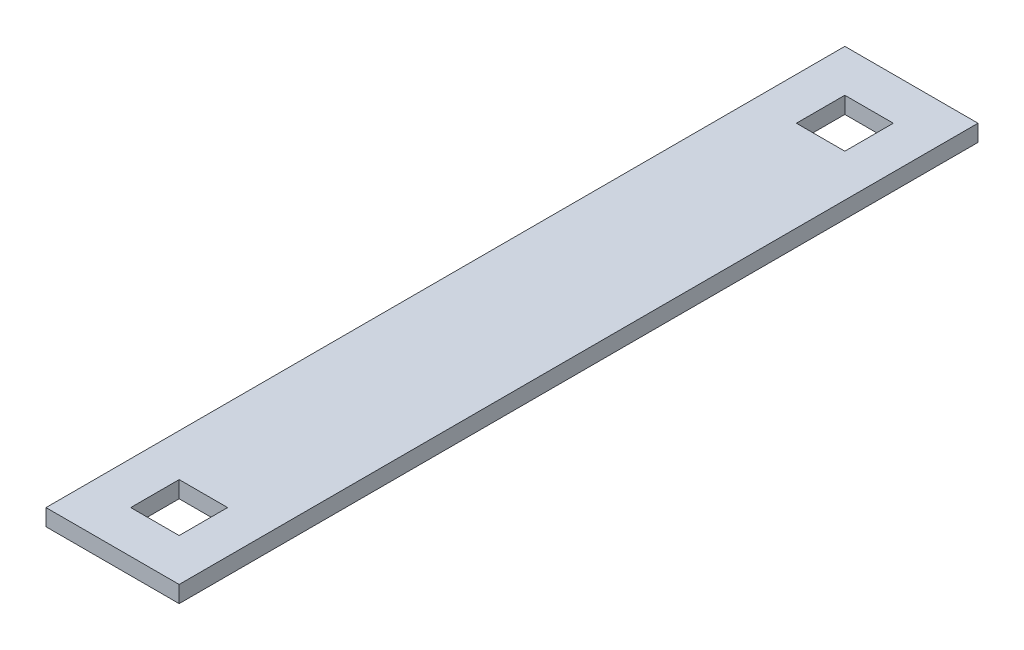
ISO-10303-21;
HEADER;
FILE_DESCRIPTION(('STEP AP214'),'2;1');
FILE_NAME('part.step','',(''),(''),'','','');
FILE_SCHEMA(('AUTOMOTIVE_DESIGN { 1 0 10303 214 1 1 1 1 }'));
ENDSEC;
DATA;
#1=APPLICATION_CONTEXT('core data for automotive mechanical design processes');
#2=APPLICATION_PROTOCOL_DEFINITION('international standard','automotive_design',2000,#1);
#3=PRODUCT_CONTEXT('',#1,'mechanical');
#4=PRODUCT('Part','Part','',(#3));
#5=PRODUCT_RELATED_PRODUCT_CATEGORY('part','',(#4));
#6=PRODUCT_DEFINITION_FORMATION('','',#4);
#7=PRODUCT_DEFINITION_CONTEXT('part definition',#1,'design');
#8=PRODUCT_DEFINITION('design','',#6,#7);
#9=PRODUCT_DEFINITION_SHAPE('','',#8);
#10=(LENGTH_UNIT() NAMED_UNIT(*) SI_UNIT(.MILLI.,.METRE.));
#11=(NAMED_UNIT(*) PLANE_ANGLE_UNIT() SI_UNIT($,.RADIAN.));
#12=(NAMED_UNIT(*) SI_UNIT($,.STERADIAN.) SOLID_ANGLE_UNIT());
#13=UNCERTAINTY_MEASURE_WITH_UNIT(LENGTH_MEASURE(1.E-05),#10,'distance_accuracy_value','');
#14=(GEOMETRIC_REPRESENTATION_CONTEXT(3) GLOBAL_UNCERTAINTY_ASSIGNED_CONTEXT((#13)) GLOBAL_UNIT_ASSIGNED_CONTEXT((#10,
#11,#12)) REPRESENTATION_CONTEXT('',''));
#15=CARTESIAN_POINT('',(0.,0.,0.));
#16=DIRECTION('',(0.,0.,1.));
#17=DIRECTION('',(1.,0.,0.));
#18=AXIS2_PLACEMENT_3D('',#15,#16,#17);
#19=CARTESIAN_POINT('',(0.,1.5875,0.));
#20=DIRECTION('',(0.,1.,0.));
#21=DIRECTION('',(0.,0.,1.));
#22=AXIS2_PLACEMENT_3D('',#19,#20,#21);
#23=PLANE('',#22);
#24=DIRECTION('',(0.,0.,1.));
#25=VECTOR('',#24,1.);
#26=CARTESIAN_POINT('',(0.,1.5875,-101.537542425712));
#27=LINE('',#26,#25);
#28=CARTESIAN_POINT('',(0.,1.5875,-101.537542425712));
#29=VERTEX_POINT('',#28);
#30=CARTESIAN_POINT('',(0.,1.5875,-25.3375424257115));
#31=VERTEX_POINT('',#30);
#32=EDGE_CURVE('E189',#29,#31,#27,.T.);
#33=ORIENTED_EDGE('',*,*,#32,.T.);
#34=DIRECTION('',(1.,0.,0.));
#35=VECTOR('',#34,1.);
#36=CARTESIAN_POINT('',(0.,1.5875,-25.3375424257115));
#37=LINE('',#36,#35);
#38=CARTESIAN_POINT('',(12.7,1.5875,-25.3375424257115));
#39=VERTEX_POINT('',#38);
#40=EDGE_CURVE('E192',#31,#39,#37,.T.);
#41=ORIENTED_EDGE('',*,*,#40,.T.);
#42=DIRECTION('',(0.,0.,-1.));
#43=VECTOR('',#42,1.);
#44=CARTESIAN_POINT('',(12.7,1.5875,-101.537542425712));
#45=LINE('',#44,#43);
#46=CARTESIAN_POINT('',(12.7,1.5875,-101.537542425712));
#47=VERTEX_POINT('',#46);
#48=EDGE_CURVE('E195',#39,#47,#45,.T.);
#49=ORIENTED_EDGE('',*,*,#48,.T.);
#50=DIRECTION('',(-1.,0.,0.));
#51=VECTOR('',#50,1.);
#52=CARTESIAN_POINT('',(0.,1.5875,-101.537542425712));
#53=LINE('',#52,#51);
#54=EDGE_CURVE('E197',#47,#29,#53,.T.);
#55=ORIENTED_EDGE('',*,*,#54,.T.);
#56=EDGE_LOOP('',(#33,#41,#49,#55));
#57=FACE_BOUND('',#56,.T.);
#58=DIRECTION('',(1.,0.,0.));
#59=VECTOR('',#58,1.);
#60=CARTESIAN_POINT('',(4.0372,1.5875,-92.8747424257115));
#61=LINE('',#60,#59);
#62=CARTESIAN_POINT('',(4.0372,1.5875,-92.8747424257115));
#63=VERTEX_POINT('',#62);
#64=CARTESIAN_POINT('',(8.66,1.5875,-92.8747424257115));
#65=VERTEX_POINT('',#64);
#66=EDGE_CURVE('E160',#63,#65,#61,.T.);
#67=ORIENTED_EDGE('',*,*,#66,.F.);
#68=DIRECTION('',(0.,0.,1.));
#69=VECTOR('',#68,1.);
#70=CARTESIAN_POINT('',(4.0372,1.5875,-97.4975424257115));
#71=LINE('',#70,#69);
#72=CARTESIAN_POINT('',(4.0372,1.5875,-97.4975424257115));
#73=VERTEX_POINT('',#72);
#74=EDGE_CURVE('E158',#73,#63,#71,.T.);
#75=ORIENTED_EDGE('',*,*,#74,.F.);
#76=DIRECTION('',(-1.,0.,0.));
#77=VECTOR('',#76,1.);
#78=CARTESIAN_POINT('',(4.0372,1.5875,-97.4975424257115));
#79=LINE('',#78,#77);
#80=CARTESIAN_POINT('',(8.66,1.5875,-97.4975424257115));
#81=VERTEX_POINT('',#80);
#82=EDGE_CURVE('E166',#81,#73,#79,.T.);
#83=ORIENTED_EDGE('',*,*,#82,.F.);
#84=DIRECTION('',(0.,0.,-1.));
#85=VECTOR('',#84,1.);
#86=CARTESIAN_POINT('',(8.66,1.5875,-97.4975424257115));
#87=LINE('',#86,#85);
#88=EDGE_CURVE('E163',#65,#81,#87,.T.);
#89=ORIENTED_EDGE('',*,*,#88,.F.);
#90=EDGE_LOOP('',(#67,#75,#83,#89));
#91=FACE_BOUND('',#90,.T.);
#92=DIRECTION('',(1.,0.,0.));
#93=VECTOR('',#92,1.);
#94=CARTESIAN_POINT('',(4.04000000000001,1.5875,-29.3775424257115));
#95=LINE('',#94,#93);
#96=CARTESIAN_POINT('',(4.04000000000001,1.5875,-29.3775424257115));
#97=VERTEX_POINT('',#96);
#98=CARTESIAN_POINT('',(8.66000000000001,1.5875,-29.3775424257115));
#99=VERTEX_POINT('',#98);
#100=EDGE_CURVE('E130',#97,#99,#95,.T.);
#101=ORIENTED_EDGE('',*,*,#100,.F.);
#102=DIRECTION('',(0.,0.,1.));
#103=VECTOR('',#102,1.);
#104=CARTESIAN_POINT('',(4.04000000000001,1.5875,-34.0003424257115));
#105=LINE('',#104,#103);
#106=CARTESIAN_POINT('',(4.04000000000001,1.5875,-34.0003424257115));
#107=VERTEX_POINT('',#106);
#108=EDGE_CURVE('E122',#107,#97,#105,.T.);
#109=ORIENTED_EDGE('',*,*,#108,.F.);
#110=DIRECTION('',(-1.,0.,0.));
#111=VECTOR('',#110,1.);
#112=CARTESIAN_POINT('',(4.04000000000001,1.5875,-34.0003424257115));
#113=LINE('',#112,#111);
#114=CARTESIAN_POINT('',(8.66000000000001,1.5875,-34.0003424257115));
#115=VERTEX_POINT('',#114);
#116=EDGE_CURVE('E144',#115,#107,#113,.T.);
#117=ORIENTED_EDGE('',*,*,#116,.F.);
#118=DIRECTION('',(0.,0.,-1.));
#119=VECTOR('',#118,1.);
#120=CARTESIAN_POINT('',(8.66000000000001,1.5875,-34.0003424257115));
#121=LINE('',#120,#119);
#122=EDGE_CURVE('E142',#99,#115,#121,.T.);
#123=ORIENTED_EDGE('',*,*,#122,.F.);
#124=EDGE_LOOP('',(#101,#109,#117,#123));
#125=FACE_BOUND('',#124,.T.);
#126=ADVANCED_FACE('F33',(#57,#91,#125),#23,.T.);
#127=CARTESIAN_POINT('',(0.,0.,0.));
#128=DIRECTION('',(0.,1.,0.));
#129=DIRECTION('',(0.,0.,1.));
#130=AXIS2_PLACEMENT_3D('',#127,#128,#129);
#131=PLANE('',#130);
#132=DIRECTION('',(0.,0.,1.));
#133=VECTOR('',#132,1.);
#134=CARTESIAN_POINT('',(4.0372,0.,-97.4975424257115));
#135=LINE('',#134,#133);
#136=CARTESIAN_POINT('',(4.0372,0.,-97.4975424257115));
#137=VERTEX_POINT('',#136);
#138=CARTESIAN_POINT('',(4.0372,0.,-92.8747424257115));
#139=VERTEX_POINT('',#138);
#140=EDGE_CURVE('E138',#137,#139,#135,.T.);
#141=ORIENTED_EDGE('',*,*,#140,.T.);
#142=DIRECTION('',(1.,0.,0.));
#143=VECTOR('',#142,1.);
#144=CARTESIAN_POINT('',(4.0372,0.,-92.8747424257115));
#145=LINE('',#144,#143);
#146=CARTESIAN_POINT('',(8.66,0.,-92.8747424257115));
#147=VERTEX_POINT('',#146);
#148=EDGE_CURVE('E171',#139,#147,#145,.T.);
#149=ORIENTED_EDGE('',*,*,#148,.T.);
#150=DIRECTION('',(0.,0.,-1.));
#151=VECTOR('',#150,1.);
#152=CARTESIAN_POINT('',(8.66,0.,-97.4975424257115));
#153=LINE('',#152,#151);
#154=CARTESIAN_POINT('',(8.66,0.,-97.4975424257115));
#155=VERTEX_POINT('',#154);
#156=EDGE_CURVE('E174',#147,#155,#153,.T.);
#157=ORIENTED_EDGE('',*,*,#156,.T.);
#158=DIRECTION('',(-1.,0.,0.));
#159=VECTOR('',#158,1.);
#160=CARTESIAN_POINT('',(4.0372,0.,-97.4975424257115));
#161=LINE('',#160,#159);
#162=EDGE_CURVE('E161',#155,#137,#161,.T.);
#163=ORIENTED_EDGE('',*,*,#162,.T.);
#164=EDGE_LOOP('',(#141,#149,#157,#163));
#165=FACE_BOUND('',#164,.T.);
#166=DIRECTION('',(0.,0.,1.));
#167=VECTOR('',#166,1.);
#168=CARTESIAN_POINT('',(0.,0.,-101.537542425712));
#169=LINE('',#168,#167);
#170=CARTESIAN_POINT('',(0.,0.,-101.537542425712));
#171=VERTEX_POINT('',#170);
#172=CARTESIAN_POINT('',(0.,0.,-25.3375424257115));
#173=VERTEX_POINT('',#172);
#174=EDGE_CURVE('E188',#171,#173,#169,.T.);
#175=ORIENTED_EDGE('',*,*,#174,.F.);
#176=DIRECTION('',(-1.,0.,0.));
#177=VECTOR('',#176,1.);
#178=CARTESIAN_POINT('',(0.,0.,-101.537542425712));
#179=LINE('',#178,#177);
#180=CARTESIAN_POINT('',(12.7,0.,-101.537542425712));
#181=VERTEX_POINT('',#180);
#182=EDGE_CURVE('E193',#181,#171,#179,.T.);
#183=ORIENTED_EDGE('',*,*,#182,.F.);
#184=DIRECTION('',(0.,0.,-1.));
#185=VECTOR('',#184,1.);
#186=CARTESIAN_POINT('',(12.7,0.,-101.537542425712));
#187=LINE('',#186,#185);
#188=CARTESIAN_POINT('',(12.7,0.,-25.3375424257115));
#189=VERTEX_POINT('',#188);
#190=EDGE_CURVE('E204',#189,#181,#187,.T.);
#191=ORIENTED_EDGE('',*,*,#190,.F.);
#192=DIRECTION('',(1.,0.,0.));
#193=VECTOR('',#192,1.);
#194=CARTESIAN_POINT('',(0.,0.,-25.3375424257115));
#195=LINE('',#194,#193);
#196=EDGE_CURVE('E202',#173,#189,#195,.T.);
#197=ORIENTED_EDGE('',*,*,#196,.F.);
#198=EDGE_LOOP('',(#175,#183,#191,#197));
#199=FACE_BOUND('',#198,.T.);
#200=DIRECTION('',(0.,0.,1.));
#201=VECTOR('',#200,1.);
#202=CARTESIAN_POINT('',(4.04000000000001,0.,-34.0003424257115));
#203=LINE('',#202,#201);
#204=CARTESIAN_POINT('',(4.04000000000001,0.,-34.0003424257115));
#205=VERTEX_POINT('',#204);
#206=CARTESIAN_POINT('',(4.04000000000001,0.,-29.3775424257115));
#207=VERTEX_POINT('',#206);
#208=EDGE_CURVE('E56',#205,#207,#203,.T.);
#209=ORIENTED_EDGE('',*,*,#208,.T.);
#210=DIRECTION('',(1.,0.,0.));
#211=VECTOR('',#210,1.);
#212=CARTESIAN_POINT('',(4.04000000000001,0.,-29.3775424257115));
#213=LINE('',#212,#211);
#214=CARTESIAN_POINT('',(8.66000000000001,0.,-29.3775424257115));
#215=VERTEX_POINT('',#214);
#216=EDGE_CURVE('E137',#207,#215,#213,.T.);
#217=ORIENTED_EDGE('',*,*,#216,.T.);
#218=DIRECTION('',(0.,0.,-1.));
#219=VECTOR('',#218,1.);
#220=CARTESIAN_POINT('',(8.66000000000001,0.,-34.0003424257115));
#221=LINE('',#220,#219);
#222=CARTESIAN_POINT('',(8.66000000000001,0.,-34.0003424257115));
#223=VERTEX_POINT('',#222);
#224=EDGE_CURVE('E150',#215,#223,#221,.T.);
#225=ORIENTED_EDGE('',*,*,#224,.T.);
#226=DIRECTION('',(-1.,0.,0.));
#227=VECTOR('',#226,1.);
#228=CARTESIAN_POINT('',(4.04000000000001,0.,-34.0003424257115));
#229=LINE('',#228,#227);
#230=EDGE_CURVE('E131',#223,#205,#229,.T.);
#231=ORIENTED_EDGE('',*,*,#230,.T.);
#232=EDGE_LOOP('',(#209,#217,#225,#231));
#233=FACE_BOUND('',#232,.T.);
#234=ADVANCED_FACE('F222',(#165,#199,#233),#131,.F.);
#235=CARTESIAN_POINT('',(0.,1.5875,-101.537542425712));
#236=DIRECTION('',(1.,0.,0.));
#237=DIRECTION('',(0.,0.,-1.));
#238=AXIS2_PLACEMENT_3D('',#235,#236,#237);
#239=PLANE('',#238);
#240=ORIENTED_EDGE('',*,*,#174,.T.);
#241=DIRECTION('',(0.,-1.,0.));
#242=VECTOR('',#241,1.);
#243=CARTESIAN_POINT('',(0.,1.5875,-25.3375424257115));
#244=LINE('',#243,#242);
#245=EDGE_CURVE('E11',#31,#173,#244,.T.);
#246=ORIENTED_EDGE('',*,*,#245,.F.);
#247=ORIENTED_EDGE('',*,*,#32,.F.);
#248=DIRECTION('',(0.,-1.,0.));
#249=VECTOR('',#248,1.);
#250=CARTESIAN_POINT('',(0.,1.5875,-101.537542425712));
#251=LINE('',#250,#249);
#252=EDGE_CURVE('E199',#29,#171,#251,.T.);
#253=ORIENTED_EDGE('',*,*,#252,.T.);
#254=EDGE_LOOP('',(#240,#246,#247,#253));
#255=FACE_BOUND('',#254,.T.);
#256=ADVANCED_FACE('F35',(#255),#239,.F.);
#257=CARTESIAN_POINT('',(0.,1.5875,-25.3375424257115));
#258=DIRECTION('',(0.,0.,-1.));
#259=DIRECTION('',(-1.,0.,0.));
#260=AXIS2_PLACEMENT_3D('',#257,#258,#259);
#261=PLANE('',#260);
#262=ORIENTED_EDGE('',*,*,#196,.T.);
#263=DIRECTION('',(0.,-1.,0.));
#264=VECTOR('',#263,1.);
#265=CARTESIAN_POINT('',(12.7,1.5875,-25.3375424257115));
#266=LINE('',#265,#264);
#267=EDGE_CURVE('E41',#39,#189,#266,.T.);
#268=ORIENTED_EDGE('',*,*,#267,.F.);
#269=ORIENTED_EDGE('',*,*,#40,.F.);
#270=ORIENTED_EDGE('',*,*,#245,.T.);
#271=EDGE_LOOP('',(#262,#268,#269,#270));
#272=FACE_BOUND('',#271,.T.);
#273=ADVANCED_FACE('F233',(#272),#261,.F.);
#274=CARTESIAN_POINT('',(12.7,1.5875,-101.537542425712));
#275=DIRECTION('',(-1.,0.,0.));
#276=DIRECTION('',(0.,0.,1.));
#277=AXIS2_PLACEMENT_3D('',#274,#275,#276);
#278=PLANE('',#277);
#279=ORIENTED_EDGE('',*,*,#190,.T.);
#280=DIRECTION('',(0.,-1.,0.));
#281=VECTOR('',#280,1.);
#282=CARTESIAN_POINT('',(12.7,1.5875,-101.537542425712));
#283=LINE('',#282,#281);
#284=EDGE_CURVE('E209',#47,#181,#283,.T.);
#285=ORIENTED_EDGE('',*,*,#284,.F.);
#286=ORIENTED_EDGE('',*,*,#48,.F.);
#287=ORIENTED_EDGE('',*,*,#267,.T.);
#288=EDGE_LOOP('',(#279,#285,#286,#287));
#289=FACE_BOUND('',#288,.T.);
#290=ADVANCED_FACE('F216',(#289),#278,.F.);
#291=CARTESIAN_POINT('',(0.,1.5875,-101.537542425712));
#292=DIRECTION('',(0.,0.,1.));
#293=DIRECTION('',(1.,0.,0.));
#294=AXIS2_PLACEMENT_3D('',#291,#292,#293);
#295=PLANE('',#294);
#296=ORIENTED_EDGE('',*,*,#182,.T.);
#297=ORIENTED_EDGE('',*,*,#252,.F.);
#298=ORIENTED_EDGE('',*,*,#54,.F.);
#299=ORIENTED_EDGE('',*,*,#284,.T.);
#300=EDGE_LOOP('',(#296,#297,#298,#299));
#301=FACE_BOUND('',#300,.T.);
#302=ADVANCED_FACE('F226',(#301),#295,.F.);
#303=CARTESIAN_POINT('',(4.0372,1.5875,-97.4975424257115));
#304=DIRECTION('',(1.,0.,0.));
#305=DIRECTION('',(0.,0.,-1.));
#306=AXIS2_PLACEMENT_3D('',#303,#304,#305);
#307=PLANE('',#306);
#308=ORIENTED_EDGE('',*,*,#140,.F.);
#309=DIRECTION('',(0.,-1.,0.));
#310=VECTOR('',#309,1.);
#311=CARTESIAN_POINT('',(4.0372,1.5875,-97.4975424257115));
#312=LINE('',#311,#310);
#313=EDGE_CURVE('E168',#73,#137,#312,.T.);
#314=ORIENTED_EDGE('',*,*,#313,.F.);
#315=ORIENTED_EDGE('',*,*,#74,.T.);
#316=DIRECTION('',(0.,-1.,0.));
#317=VECTOR('',#316,1.);
#318=CARTESIAN_POINT('',(4.0372,1.5875,-92.8747424257115));
#319=LINE('',#318,#317);
#320=EDGE_CURVE('E185',#63,#139,#319,.T.);
#321=ORIENTED_EDGE('',*,*,#320,.T.);
#322=EDGE_LOOP('',(#308,#314,#315,#321));
#323=FACE_BOUND('',#322,.T.);
#324=ADVANCED_FACE('F248',(#323),#307,.T.);
#325=CARTESIAN_POINT('',(4.0372,1.5875,-92.8747424257115));
#326=DIRECTION('',(0.,0.,-1.));
#327=DIRECTION('',(-1.,0.,0.));
#328=AXIS2_PLACEMENT_3D('',#325,#326,#327);
#329=PLANE('',#328);
#330=ORIENTED_EDGE('',*,*,#148,.F.);
#331=ORIENTED_EDGE('',*,*,#320,.F.);
#332=ORIENTED_EDGE('',*,*,#66,.T.);
#333=DIRECTION('',(0.,-1.,0.));
#334=VECTOR('',#333,1.);
#335=CARTESIAN_POINT('',(8.66,1.5875,-92.8747424257115));
#336=LINE('',#335,#334);
#337=EDGE_CURVE('E183',#65,#147,#336,.T.);
#338=ORIENTED_EDGE('',*,*,#337,.T.);
#339=EDGE_LOOP('',(#330,#331,#332,#338));
#340=FACE_BOUND('',#339,.T.);
#341=ADVANCED_FACE('F255',(#340),#329,.T.);
#342=CARTESIAN_POINT('',(8.66,1.5875,-97.4975424257115));
#343=DIRECTION('',(-1.,0.,0.));
#344=DIRECTION('',(0.,0.,1.));
#345=AXIS2_PLACEMENT_3D('',#342,#343,#344);
#346=PLANE('',#345);
#347=ORIENTED_EDGE('',*,*,#156,.F.);
#348=ORIENTED_EDGE('',*,*,#337,.F.);
#349=ORIENTED_EDGE('',*,*,#88,.T.);
#350=DIRECTION('',(0.,-1.,0.));
#351=VECTOR('',#350,1.);
#352=CARTESIAN_POINT('',(8.66,1.5875,-97.4975424257115));
#353=LINE('',#352,#351);
#354=EDGE_CURVE('E181',#81,#155,#353,.T.);
#355=ORIENTED_EDGE('',*,*,#354,.T.);
#356=EDGE_LOOP('',(#347,#348,#349,#355));
#357=FACE_BOUND('',#356,.T.);
#358=ADVANCED_FACE('F260',(#357),#346,.T.);
#359=CARTESIAN_POINT('',(4.0372,1.5875,-97.4975424257115));
#360=DIRECTION('',(0.,0.,1.));
#361=DIRECTION('',(1.,0.,0.));
#362=AXIS2_PLACEMENT_3D('',#359,#360,#361);
#363=PLANE('',#362);
#364=ORIENTED_EDGE('',*,*,#162,.F.);
#365=ORIENTED_EDGE('',*,*,#354,.F.);
#366=ORIENTED_EDGE('',*,*,#82,.T.);
#367=ORIENTED_EDGE('',*,*,#313,.T.);
#368=EDGE_LOOP('',(#364,#365,#366,#367));
#369=FACE_BOUND('',#368,.T.);
#370=ADVANCED_FACE('F267',(#369),#363,.T.);
#371=CARTESIAN_POINT('',(4.04000000000001,1.5875,-34.0003424257115));
#372=DIRECTION('',(1.,0.,0.));
#373=DIRECTION('',(0.,0.,-1.));
#374=AXIS2_PLACEMENT_3D('',#371,#372,#373);
#375=PLANE('',#374);
#376=ORIENTED_EDGE('',*,*,#208,.F.);
#377=DIRECTION('',(0.,-1.,0.));
#378=VECTOR('',#377,1.);
#379=CARTESIAN_POINT('',(4.04000000000001,1.5875,-34.0003424257115));
#380=LINE('',#379,#378);
#381=EDGE_CURVE('E126',#107,#205,#380,.T.);
#382=ORIENTED_EDGE('',*,*,#381,.F.);
#383=ORIENTED_EDGE('',*,*,#108,.T.);
#384=DIRECTION('',(0.,-1.,0.));
#385=VECTOR('',#384,1.);
#386=CARTESIAN_POINT('',(4.04000000000001,1.5875,-29.3775424257115));
#387=LINE('',#386,#385);
#388=EDGE_CURVE('E125',#97,#207,#387,.T.);
#389=ORIENTED_EDGE('',*,*,#388,.T.);
#390=EDGE_LOOP('',(#376,#382,#383,#389));
#391=FACE_BOUND('',#390,.T.);
#392=ADVANCED_FACE('F124',(#391),#375,.T.);
#393=CARTESIAN_POINT('',(4.04000000000001,1.5875,-29.3775424257115));
#394=DIRECTION('',(0.,0.,-1.));
#395=DIRECTION('',(-1.,0.,0.));
#396=AXIS2_PLACEMENT_3D('',#393,#394,#395);
#397=PLANE('',#396);
#398=ORIENTED_EDGE('',*,*,#216,.F.);
#399=ORIENTED_EDGE('',*,*,#388,.F.);
#400=ORIENTED_EDGE('',*,*,#100,.T.);
#401=DIRECTION('',(0.,-1.,0.));
#402=VECTOR('',#401,1.);
#403=CARTESIAN_POINT('',(8.66000000000001,1.5875,-29.3775424257115));
#404=LINE('',#403,#402);
#405=EDGE_CURVE('E139',#99,#215,#404,.T.);
#406=ORIENTED_EDGE('',*,*,#405,.T.);
#407=EDGE_LOOP('',(#398,#399,#400,#406));
#408=FACE_BOUND('',#407,.T.);
#409=ADVANCED_FACE('F134',(#408),#397,.T.);
#410=CARTESIAN_POINT('',(8.66000000000001,1.5875,-34.0003424257115));
#411=DIRECTION('',(-1.,0.,0.));
#412=DIRECTION('',(0.,0.,1.));
#413=AXIS2_PLACEMENT_3D('',#410,#411,#412);
#414=PLANE('',#413);
#415=ORIENTED_EDGE('',*,*,#224,.F.);
#416=ORIENTED_EDGE('',*,*,#405,.F.);
#417=ORIENTED_EDGE('',*,*,#122,.T.);
#418=DIRECTION('',(0.,-1.,0.));
#419=VECTOR('',#418,1.);
#420=CARTESIAN_POINT('',(8.66000000000001,1.5875,-34.0003424257115));
#421=LINE('',#420,#419);
#422=EDGE_CURVE('E48',#115,#223,#421,.T.);
#423=ORIENTED_EDGE('',*,*,#422,.T.);
#424=EDGE_LOOP('',(#415,#416,#417,#423));
#425=FACE_BOUND('',#424,.T.);
#426=ADVANCED_FACE('F285',(#425),#414,.T.);
#427=CARTESIAN_POINT('',(4.04000000000001,1.5875,-34.0003424257115));
#428=DIRECTION('',(0.,0.,1.));
#429=DIRECTION('',(1.,0.,0.));
#430=AXIS2_PLACEMENT_3D('',#427,#428,#429);
#431=PLANE('',#430);
#432=ORIENTED_EDGE('',*,*,#230,.F.);
#433=ORIENTED_EDGE('',*,*,#422,.F.);
#434=ORIENTED_EDGE('',*,*,#116,.T.);
#435=ORIENTED_EDGE('',*,*,#381,.T.);
#436=EDGE_LOOP('',(#432,#433,#434,#435));
#437=FACE_BOUND('',#436,.T.);
#438=ADVANCED_FACE('F288',(#437),#431,.T.);
#439=CLOSED_SHELL('',(#126,#234,#256,#273,#290,#302,#324,#341,#358,#370,#392,#409,#426,#438));
#440=MANIFOLD_SOLID_BREP('B2',#439);
#441=ADVANCED_BREP_SHAPE_REPRESENTATION('',(#18,#440),#14);
#442=SHAPE_DEFINITION_REPRESENTATION(#9,#441);
ENDSEC;
END-ISO-10303-21;
